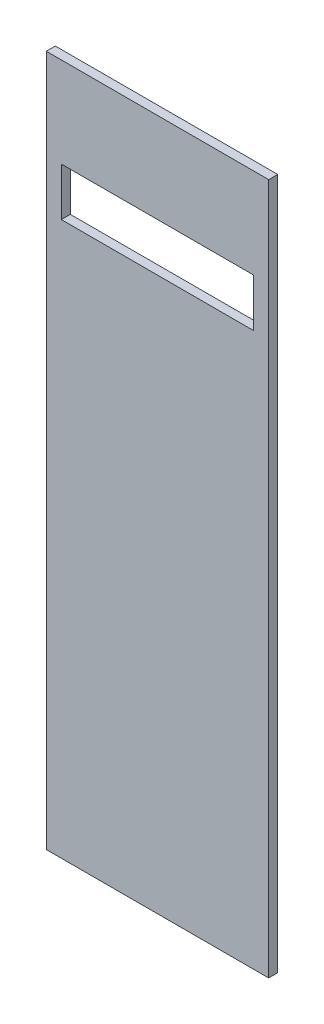
ISO-10303-21;
HEADER;
FILE_DESCRIPTION(('STEP AP214'),'2;1');
FILE_NAME('part.step','',(''),(''),'','','');
FILE_SCHEMA(('AUTOMOTIVE_DESIGN { 1 0 10303 214 1 1 1 1 }'));
ENDSEC;
DATA;
#1=APPLICATION_CONTEXT('core data for automotive mechanical design processes');
#2=APPLICATION_PROTOCOL_DEFINITION('international standard','automotive_design',2000,#1);
#3=PRODUCT_CONTEXT('',#1,'mechanical');
#4=PRODUCT('Part','Part','',(#3));
#5=PRODUCT_RELATED_PRODUCT_CATEGORY('part','',(#4));
#6=PRODUCT_DEFINITION_FORMATION('','',#4);
#7=PRODUCT_DEFINITION_CONTEXT('part definition',#1,'design');
#8=PRODUCT_DEFINITION('design','',#6,#7);
#9=PRODUCT_DEFINITION_SHAPE('','',#8);
#10=(LENGTH_UNIT() NAMED_UNIT(*) SI_UNIT(.MILLI.,.METRE.));
#11=(NAMED_UNIT(*) PLANE_ANGLE_UNIT() SI_UNIT($,.RADIAN.));
#12=(NAMED_UNIT(*) SI_UNIT($,.STERADIAN.) SOLID_ANGLE_UNIT());
#13=UNCERTAINTY_MEASURE_WITH_UNIT(LENGTH_MEASURE(1.E-05),#10,'distance_accuracy_value','');
#14=(GEOMETRIC_REPRESENTATION_CONTEXT(3) GLOBAL_UNCERTAINTY_ASSIGNED_CONTEXT((#13)) GLOBAL_UNIT_ASSIGNED_CONTEXT((#10,
#11,#12)) REPRESENTATION_CONTEXT('',''));
#15=CARTESIAN_POINT('',(0.,0.,0.));
#16=DIRECTION('',(0.,0.,1.));
#17=DIRECTION('',(1.,0.,0.));
#18=AXIS2_PLACEMENT_3D('',#15,#16,#17);
#19=CARTESIAN_POINT('',(185.,575.,15.));
#20=DIRECTION('',(-1.,0.,0.));
#21=DIRECTION('',(0.,-1.,0.));
#22=AXIS2_PLACEMENT_3D('',#19,#20,#21);
#23=PLANE('',#22);
#24=DIRECTION('',(0.,1.,0.));
#25=VECTOR('',#24,1.);
#26=CARTESIAN_POINT('',(185.,575.,0.));
#27=LINE('',#26,#25);
#28=CARTESIAN_POINT('',(185.,-575.,0.));
#29=VERTEX_POINT('',#28);
#30=CARTESIAN_POINT('',(185.,575.,0.));
#31=VERTEX_POINT('',#30);
#32=EDGE_CURVE('E146',#29,#31,#27,.T.);
#33=ORIENTED_EDGE('',*,*,#32,.T.);
#34=DIRECTION('',(0.,0.,-1.));
#35=VECTOR('',#34,1.);
#36=CARTESIAN_POINT('',(185.,575.,15.));
#37=LINE('',#36,#35);
#38=CARTESIAN_POINT('',(185.,575.,15.));
#39=VERTEX_POINT('',#38);
#40=EDGE_CURVE('E11',#39,#31,#37,.T.);
#41=ORIENTED_EDGE('',*,*,#40,.F.);
#42=DIRECTION('',(0.,1.,0.));
#43=VECTOR('',#42,1.);
#44=CARTESIAN_POINT('',(185.,575.,15.));
#45=LINE('',#44,#43);
#46=CARTESIAN_POINT('',(185.,-575.,15.));
#47=VERTEX_POINT('',#46);
#48=EDGE_CURVE('E152',#47,#39,#45,.T.);
#49=ORIENTED_EDGE('',*,*,#48,.F.);
#50=DIRECTION('',(0.,0.,-1.));
#51=VECTOR('',#50,1.);
#52=CARTESIAN_POINT('',(185.,-575.,15.));
#53=LINE('',#52,#51);
#54=EDGE_CURVE('E166',#47,#29,#53,.T.);
#55=ORIENTED_EDGE('',*,*,#54,.T.);
#56=EDGE_LOOP('',(#33,#41,#49,#55));
#57=FACE_BOUND('',#56,.T.);
#58=ADVANCED_FACE('F38',(#57),#23,.F.);
#59=CARTESIAN_POINT('',(-185.,575.,15.));
#60=DIRECTION('',(0.,-1.,0.));
#61=DIRECTION('',(0.,0.,-1.));
#62=AXIS2_PLACEMENT_3D('',#59,#60,#61);
#63=PLANE('',#62);
#64=DIRECTION('',(-1.,0.,0.));
#65=VECTOR('',#64,1.);
#66=CARTESIAN_POINT('',(-185.,575.,0.));
#67=LINE('',#66,#65);
#68=CARTESIAN_POINT('',(-185.,575.,0.));
#69=VERTEX_POINT('',#68);
#70=EDGE_CURVE('E170',#31,#69,#67,.T.);
#71=ORIENTED_EDGE('',*,*,#70,.T.);
#72=DIRECTION('',(0.,0.,-1.));
#73=VECTOR('',#72,1.);
#74=CARTESIAN_POINT('',(-185.,575.,15.));
#75=LINE('',#74,#73);
#76=CARTESIAN_POINT('',(-185.,575.,15.));
#77=VERTEX_POINT('',#76);
#78=EDGE_CURVE('E46',#77,#69,#75,.T.);
#79=ORIENTED_EDGE('',*,*,#78,.F.);
#80=DIRECTION('',(-1.,0.,0.));
#81=VECTOR('',#80,1.);
#82=CARTESIAN_POINT('',(-185.,575.,15.));
#83=LINE('',#82,#81);
#84=EDGE_CURVE('E156',#39,#77,#83,.T.);
#85=ORIENTED_EDGE('',*,*,#84,.F.);
#86=ORIENTED_EDGE('',*,*,#40,.T.);
#87=EDGE_LOOP('',(#71,#79,#85,#86));
#88=FACE_BOUND('',#87,.T.);
#89=ADVANCED_FACE('F204',(#88),#63,.F.);
#90=CARTESIAN_POINT('',(-185.,575.,15.));
#91=DIRECTION('',(1.,0.,0.));
#92=DIRECTION('',(0.,1.,0.));
#93=AXIS2_PLACEMENT_3D('',#90,#91,#92);
#94=PLANE('',#93);
#95=DIRECTION('',(0.,-1.,0.));
#96=VECTOR('',#95,1.);
#97=CARTESIAN_POINT('',(-185.,575.,0.));
#98=LINE('',#97,#96);
#99=CARTESIAN_POINT('',(-185.,-575.,0.));
#100=VERTEX_POINT('',#99);
#101=EDGE_CURVE('E173',#69,#100,#98,.T.);
#102=ORIENTED_EDGE('',*,*,#101,.T.);
#103=DIRECTION('',(0.,0.,-1.));
#104=VECTOR('',#103,1.);
#105=CARTESIAN_POINT('',(-185.,-575.,15.));
#106=LINE('',#105,#104);
#107=CARTESIAN_POINT('',(-185.,-575.,15.));
#108=VERTEX_POINT('',#107);
#109=EDGE_CURVE('E181',#108,#100,#106,.T.);
#110=ORIENTED_EDGE('',*,*,#109,.F.);
#111=DIRECTION('',(0.,-1.,0.));
#112=VECTOR('',#111,1.);
#113=CARTESIAN_POINT('',(-185.,575.,15.));
#114=LINE('',#113,#112);
#115=EDGE_CURVE('E160',#77,#108,#114,.T.);
#116=ORIENTED_EDGE('',*,*,#115,.F.);
#117=ORIENTED_EDGE('',*,*,#78,.T.);
#118=EDGE_LOOP('',(#102,#110,#116,#117));
#119=FACE_BOUND('',#118,.T.);
#120=ADVANCED_FACE('F190',(#119),#94,.F.);
#121=CARTESIAN_POINT('',(-185.,-575.,15.));
#122=DIRECTION('',(0.,1.,0.));
#123=DIRECTION('',(0.,0.,1.));
#124=AXIS2_PLACEMENT_3D('',#121,#122,#123);
#125=PLANE('',#124);
#126=DIRECTION('',(1.,0.,0.));
#127=VECTOR('',#126,1.);
#128=CARTESIAN_POINT('',(-185.,-575.,0.));
#129=LINE('',#128,#127);
#130=EDGE_CURVE('E157',#100,#29,#129,.T.);
#131=ORIENTED_EDGE('',*,*,#130,.T.);
#132=ORIENTED_EDGE('',*,*,#54,.F.);
#133=DIRECTION('',(1.,0.,0.));
#134=VECTOR('',#133,1.);
#135=CARTESIAN_POINT('',(-185.,-575.,15.));
#136=LINE('',#135,#134);
#137=EDGE_CURVE('E163',#108,#47,#136,.T.);
#138=ORIENTED_EDGE('',*,*,#137,.F.);
#139=ORIENTED_EDGE('',*,*,#109,.T.);
#140=EDGE_LOOP('',(#131,#132,#138,#139));
#141=FACE_BOUND('',#140,.T.);
#142=ADVANCED_FACE('F197',(#141),#125,.F.);
#143=CARTESIAN_POINT('',(0.,0.,15.));
#144=DIRECTION('',(0.,0.,1.));
#145=DIRECTION('',(1.,0.,0.));
#146=AXIS2_PLACEMENT_3D('',#143,#144,#145);
#147=PLANE('',#146);
#148=DIRECTION('',(0.,1.,0.));
#149=VECTOR('',#148,1.);
#150=CARTESIAN_POINT('',(160.,425.,15.));
#151=LINE('',#150,#149);
#152=CARTESIAN_POINT('',(160.,345.,15.));
#153=VERTEX_POINT('',#152);
#154=CARTESIAN_POINT('',(160.,425.,15.));
#155=VERTEX_POINT('',#154);
#156=EDGE_CURVE('E53',#153,#155,#151,.T.);
#157=ORIENTED_EDGE('',*,*,#156,.F.);
#158=DIRECTION('',(1.,0.,0.));
#159=VECTOR('',#158,1.);
#160=CARTESIAN_POINT('',(-160.,345.,15.));
#161=LINE('',#160,#159);
#162=CARTESIAN_POINT('',(-160.,345.,15.));
#163=VERTEX_POINT('',#162);
#164=EDGE_CURVE('E124',#163,#153,#161,.T.);
#165=ORIENTED_EDGE('',*,*,#164,.F.);
#166=DIRECTION('',(0.,-1.,0.));
#167=VECTOR('',#166,1.);
#168=CARTESIAN_POINT('',(-160.,425.,15.));
#169=LINE('',#168,#167);
#170=CARTESIAN_POINT('',(-160.,425.,15.));
#171=VERTEX_POINT('',#170);
#172=EDGE_CURVE('E128',#171,#163,#169,.T.);
#173=ORIENTED_EDGE('',*,*,#172,.F.);
#174=DIRECTION('',(-1.,0.,0.));
#175=VECTOR('',#174,1.);
#176=CARTESIAN_POINT('',(-160.,425.,15.));
#177=LINE('',#176,#175);
#178=EDGE_CURVE('E137',#155,#171,#177,.T.);
#179=ORIENTED_EDGE('',*,*,#178,.F.);
#180=EDGE_LOOP('',(#157,#165,#173,#179));
#181=FACE_BOUND('',#180,.T.);
#182=ORIENTED_EDGE('',*,*,#48,.T.);
#183=ORIENTED_EDGE('',*,*,#84,.T.);
#184=ORIENTED_EDGE('',*,*,#115,.T.);
#185=ORIENTED_EDGE('',*,*,#137,.T.);
#186=EDGE_LOOP('',(#182,#183,#184,#185));
#187=FACE_BOUND('',#186,.T.);
#188=ADVANCED_FACE('F203',(#181,#187),#147,.T.);
#189=CARTESIAN_POINT('',(0.,0.,0.));
#190=DIRECTION('',(0.,0.,1.));
#191=DIRECTION('',(1.,0.,0.));
#192=AXIS2_PLACEMENT_3D('',#189,#190,#191);
#193=PLANE('',#192);
#194=DIRECTION('',(1.,0.,0.));
#195=VECTOR('',#194,1.);
#196=CARTESIAN_POINT('',(-160.,345.,0.));
#197=LINE('',#196,#195);
#198=CARTESIAN_POINT('',(-160.,345.,0.));
#199=VERTEX_POINT('',#198);
#200=CARTESIAN_POINT('',(160.,345.,0.));
#201=VERTEX_POINT('',#200);
#202=EDGE_CURVE('E112',#199,#201,#197,.T.);
#203=ORIENTED_EDGE('',*,*,#202,.T.);
#204=DIRECTION('',(0.,1.,0.));
#205=VECTOR('',#204,1.);
#206=CARTESIAN_POINT('',(160.,425.,0.));
#207=LINE('',#206,#205);
#208=CARTESIAN_POINT('',(160.,425.,0.));
#209=VERTEX_POINT('',#208);
#210=EDGE_CURVE('E105',#201,#209,#207,.T.);
#211=ORIENTED_EDGE('',*,*,#210,.T.);
#212=DIRECTION('',(-1.,0.,0.));
#213=VECTOR('',#212,1.);
#214=CARTESIAN_POINT('',(-160.,425.,0.));
#215=LINE('',#214,#213);
#216=CARTESIAN_POINT('',(-160.,425.,0.));
#217=VERTEX_POINT('',#216);
#218=EDGE_CURVE('E115',#209,#217,#215,.T.);
#219=ORIENTED_EDGE('',*,*,#218,.T.);
#220=DIRECTION('',(0.,-1.,0.));
#221=VECTOR('',#220,1.);
#222=CARTESIAN_POINT('',(-160.,425.,0.));
#223=LINE('',#222,#221);
#224=EDGE_CURVE('E61',#217,#199,#223,.T.);
#225=ORIENTED_EDGE('',*,*,#224,.T.);
#226=EDGE_LOOP('',(#203,#211,#219,#225));
#227=FACE_BOUND('',#226,.T.);
#228=ORIENTED_EDGE('',*,*,#32,.F.);
#229=ORIENTED_EDGE('',*,*,#130,.F.);
#230=ORIENTED_EDGE('',*,*,#101,.F.);
#231=ORIENTED_EDGE('',*,*,#70,.F.);
#232=EDGE_LOOP('',(#228,#229,#230,#231));
#233=FACE_BOUND('',#232,.T.);
#234=ADVANCED_FACE('F120',(#227,#233),#193,.F.);
#235=CARTESIAN_POINT('',(160.,425.,0.));
#236=DIRECTION('',(1.,0.,0.));
#237=DIRECTION('',(0.,0.,-1.));
#238=AXIS2_PLACEMENT_3D('',#235,#236,#237);
#239=PLANE('',#238);
#240=ORIENTED_EDGE('',*,*,#156,.T.);
#241=DIRECTION('',(0.,0.,1.));
#242=VECTOR('',#241,1.);
#243=CARTESIAN_POINT('',(160.,425.,0.));
#244=LINE('',#243,#242);
#245=EDGE_CURVE('E101',#209,#155,#244,.T.);
#246=ORIENTED_EDGE('',*,*,#245,.F.);
#247=ORIENTED_EDGE('',*,*,#210,.F.);
#248=DIRECTION('',(0.,0.,1.));
#249=VECTOR('',#248,1.);
#250=CARTESIAN_POINT('',(160.,345.,0.));
#251=LINE('',#250,#249);
#252=EDGE_CURVE('E143',#201,#153,#251,.T.);
#253=ORIENTED_EDGE('',*,*,#252,.T.);
#254=EDGE_LOOP('',(#240,#246,#247,#253));
#255=FACE_BOUND('',#254,.T.);
#256=ADVANCED_FACE('F103',(#255),#239,.F.);
#257=CARTESIAN_POINT('',(-160.,345.,0.));
#258=DIRECTION('',(0.,-1.,0.));
#259=DIRECTION('',(0.,0.,-1.));
#260=AXIS2_PLACEMENT_3D('',#257,#258,#259);
#261=PLANE('',#260);
#262=ORIENTED_EDGE('',*,*,#164,.T.);
#263=ORIENTED_EDGE('',*,*,#252,.F.);
#264=ORIENTED_EDGE('',*,*,#202,.F.);
#265=DIRECTION('',(0.,0.,1.));
#266=VECTOR('',#265,1.);
#267=CARTESIAN_POINT('',(-160.,345.,0.));
#268=LINE('',#267,#266);
#269=EDGE_CURVE('E147',#199,#163,#268,.T.);
#270=ORIENTED_EDGE('',*,*,#269,.T.);
#271=EDGE_LOOP('',(#262,#263,#264,#270));
#272=FACE_BOUND('',#271,.T.);
#273=ADVANCED_FACE('F221',(#272),#261,.F.);
#274=CARTESIAN_POINT('',(-160.,425.,0.));
#275=DIRECTION('',(-1.,0.,0.));
#276=DIRECTION('',(0.,-1.,0.));
#277=AXIS2_PLACEMENT_3D('',#274,#275,#276);
#278=PLANE('',#277);
#279=ORIENTED_EDGE('',*,*,#172,.T.);
#280=ORIENTED_EDGE('',*,*,#269,.F.);
#281=ORIENTED_EDGE('',*,*,#224,.F.);
#282=DIRECTION('',(0.,0.,1.));
#283=VECTOR('',#282,1.);
#284=CARTESIAN_POINT('',(-160.,425.,0.));
#285=LINE('',#284,#283);
#286=EDGE_CURVE('E111',#217,#171,#285,.T.);
#287=ORIENTED_EDGE('',*,*,#286,.T.);
#288=EDGE_LOOP('',(#279,#280,#281,#287));
#289=FACE_BOUND('',#288,.T.);
#290=ADVANCED_FACE('F224',(#289),#278,.F.);
#291=CARTESIAN_POINT('',(-160.,425.,0.));
#292=DIRECTION('',(0.,1.,0.));
#293=DIRECTION('',(0.,0.,1.));
#294=AXIS2_PLACEMENT_3D('',#291,#292,#293);
#295=PLANE('',#294);
#296=ORIENTED_EDGE('',*,*,#178,.T.);
#297=ORIENTED_EDGE('',*,*,#286,.F.);
#298=ORIENTED_EDGE('',*,*,#218,.F.);
#299=ORIENTED_EDGE('',*,*,#245,.T.);
#300=EDGE_LOOP('',(#296,#297,#298,#299));
#301=FACE_BOUND('',#300,.T.);
#302=ADVANCED_FACE('F116',(#301),#295,.F.);
#303=CLOSED_SHELL('',(#58,#89,#120,#142,#188,#234,#256,#273,#290,#302));
#304=MANIFOLD_SOLID_BREP('B2',#303);
#305=ADVANCED_BREP_SHAPE_REPRESENTATION('',(#18,#304),#14);
#306=SHAPE_DEFINITION_REPRESENTATION(#9,#305);
ENDSEC;
END-ISO-10303-21;
